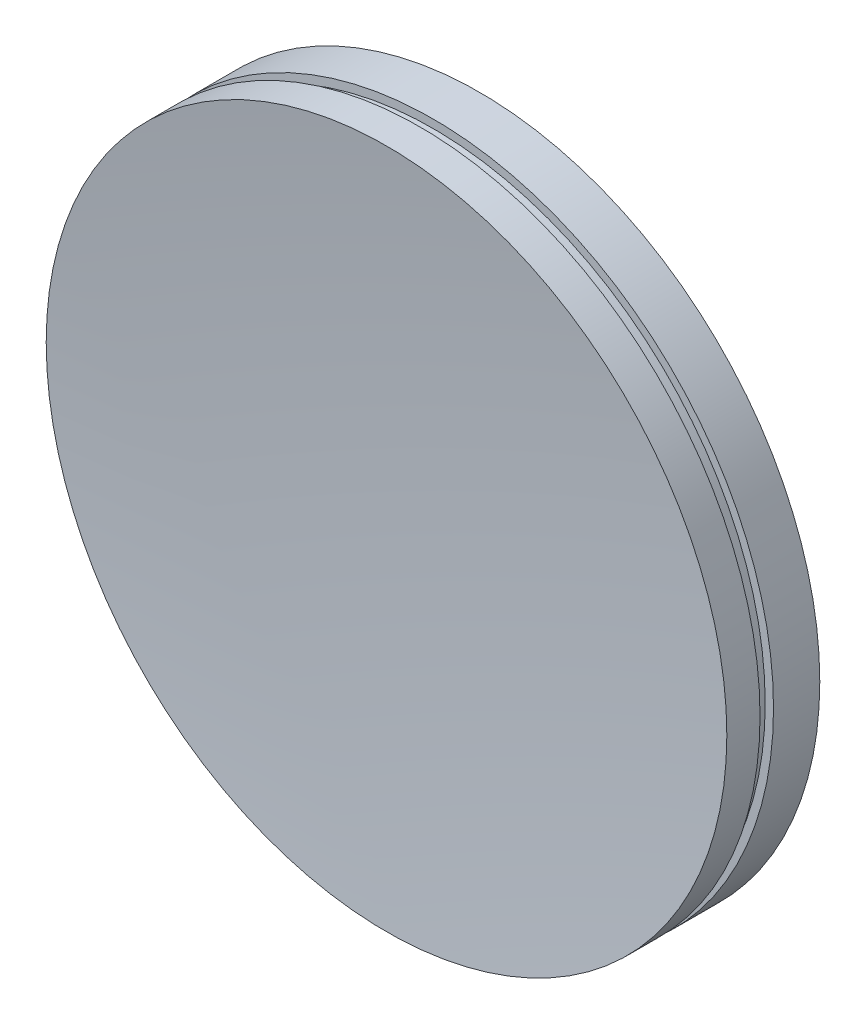
ISO-10303-21;
HEADER;
FILE_DESCRIPTION(('STEP AP214'),'2;1');
FILE_NAME('part.step','',(''),(''),'','','');
FILE_SCHEMA(('AUTOMOTIVE_DESIGN { 1 0 10303 214 1 1 1 1 }'));
ENDSEC;
DATA;
#1=APPLICATION_CONTEXT('core data for automotive mechanical design processes');
#2=APPLICATION_PROTOCOL_DEFINITION('international standard','automotive_design',2000,#1);
#3=PRODUCT_CONTEXT('',#1,'mechanical');
#4=PRODUCT('Part','Part','',(#3));
#5=PRODUCT_RELATED_PRODUCT_CATEGORY('part','',(#4));
#6=PRODUCT_DEFINITION_FORMATION('','',#4);
#7=PRODUCT_DEFINITION_CONTEXT('part definition',#1,'design');
#8=PRODUCT_DEFINITION('design','',#6,#7);
#9=PRODUCT_DEFINITION_SHAPE('','',#8);
#10=(LENGTH_UNIT() NAMED_UNIT(*) SI_UNIT(.MILLI.,.METRE.));
#11=(NAMED_UNIT(*) PLANE_ANGLE_UNIT() SI_UNIT($,.RADIAN.));
#12=(NAMED_UNIT(*) SI_UNIT($,.STERADIAN.) SOLID_ANGLE_UNIT());
#13=UNCERTAINTY_MEASURE_WITH_UNIT(LENGTH_MEASURE(1.E-05),#10,'distance_accuracy_value','');
#14=(GEOMETRIC_REPRESENTATION_CONTEXT(3) GLOBAL_UNCERTAINTY_ASSIGNED_CONTEXT((#13)) GLOBAL_UNIT_ASSIGNED_CONTEXT((#10,
#11,#12)) REPRESENTATION_CONTEXT('',''));
#15=CARTESIAN_POINT('',(0.,0.,0.));
#16=DIRECTION('',(0.,0.,1.));
#17=DIRECTION('',(1.,0.,0.));
#18=AXIS2_PLACEMENT_3D('',#15,#16,#17);
#19=CARTESIAN_POINT('',(0.,0.,56.));
#20=DIRECTION('',(0.,0.,-1.));
#21=DIRECTION('',(-1.,0.,0.));
#22=AXIS2_PLACEMENT_3D('',#19,#20,#21);
#23=CYLINDRICAL_SURFACE('',#22,205.);
#24=CARTESIAN_POINT('',(0.,0.,27.8800000000001));
#25=DIRECTION('',(0.,0.,1.));
#26=DIRECTION('',(1.,0.,0.));
#27=AXIS2_PLACEMENT_3D('',#24,#25,#26);
#28=CIRCLE('',#27,205.);
#29=CARTESIAN_POINT('',(205.,0.,27.8800000000001));
#30=VERTEX_POINT('',#29);
#31=EDGE_CURVE('E51',#30,#30,#28,.T.);
#32=ORIENTED_EDGE('',*,*,#31,.F.);
#33=EDGE_LOOP('',(#32));
#34=FACE_BOUND('',#33,.T.);
#35=CARTESIAN_POINT('',(0.,0.,0.));
#36=DIRECTION('',(0.,0.,1.));
#37=DIRECTION('',(1.,0.,0.));
#38=AXIS2_PLACEMENT_3D('',#35,#36,#37);
#39=CIRCLE('',#38,205.);
#40=CARTESIAN_POINT('',(205.,0.,0.));
#41=VERTEX_POINT('',#40);
#42=EDGE_CURVE('E10',#41,#41,#39,.T.);
#43=ORIENTED_EDGE('',*,*,#42,.T.);
#44=EDGE_LOOP('',(#43));
#45=FACE_BOUND('',#44,.T.);
#46=ADVANCED_FACE('F37',(#34,#45),#23,.T.);
#47=CARTESIAN_POINT('',(0.,0.,0.));
#48=DIRECTION('',(0.,0.,1.));
#49=DIRECTION('',(1.,0.,0.));
#50=AXIS2_PLACEMENT_3D('',#47,#48,#49);
#51=PLANE('',#50);
#52=ORIENTED_EDGE('',*,*,#42,.F.);
#53=EDGE_LOOP('',(#52));
#54=FACE_BOUND('',#53,.T.);
#55=ADVANCED_FACE('F87',(#54),#51,.F.);
#56=CARTESIAN_POINT('',(205.,0.,27.88));
#57=DIRECTION('',(0.,0.,-1.));
#58=DIRECTION('',(-1.,0.,0.));
#59=AXIS2_PLACEMENT_3D('',#56,#57,#58);
#60=PLANE('',#59);
#61=CARTESIAN_POINT('',(0.,0.,27.8800000000001));
#62=DIRECTION('',(0.,0.,1.));
#63=DIRECTION('',(1.,0.,0.));
#64=AXIS2_PLACEMENT_3D('',#61,#62,#63);
#65=CIRCLE('',#64,200.);
#66=CARTESIAN_POINT('',(200.,0.,27.8800000000001));
#67=VERTEX_POINT('',#66);
#68=EDGE_CURVE('E57',#67,#67,#65,.T.);
#69=ORIENTED_EDGE('',*,*,#68,.F.);
#70=EDGE_LOOP('',(#69));
#71=FACE_BOUND('',#70,.T.);
#72=ORIENTED_EDGE('',*,*,#31,.T.);
#73=EDGE_LOOP('',(#72));
#74=FACE_BOUND('',#73,.T.);
#75=ADVANCED_FACE('F81',(#71,#74),#60,.F.);
#76=CARTESIAN_POINT('',(2.4980018054066E-13,0.,2095.72424606857));
#77=DIRECTION('',(0.,0.,1.));
#78=DIRECTION('',(1.,0.,0.));
#79=AXIS2_PLACEMENT_3D('',#76,#77,#78);
#80=CYLINDRICAL_SURFACE('',#79,200.);
#81=CARTESIAN_POINT('',(0.,0.,36.));
#82=DIRECTION('',(0.,0.,1.));
#83=DIRECTION('',(1.,0.,0.));
#84=AXIS2_PLACEMENT_3D('',#81,#82,#83);
#85=CIRCLE('',#84,200.);
#86=CARTESIAN_POINT('',(200.,0.,36.));
#87=VERTEX_POINT('',#86);
#88=EDGE_CURVE('E62',#87,#87,#85,.T.);
#89=ORIENTED_EDGE('',*,*,#88,.F.);
#90=EDGE_LOOP('',(#89));
#91=FACE_BOUND('',#90,.T.);
#92=ORIENTED_EDGE('',*,*,#68,.T.);
#93=EDGE_LOOP('',(#92));
#94=FACE_BOUND('',#93,.T.);
#95=ADVANCED_FACE('F75',(#91,#94),#80,.T.);
#96=CARTESIAN_POINT('',(205.,0.,36.));
#97=DIRECTION('',(0.,0.,1.));
#98=DIRECTION('',(1.,0.,0.));
#99=AXIS2_PLACEMENT_3D('',#96,#97,#98);
#100=PLANE('',#99);
#101=CARTESIAN_POINT('',(0.,0.,36.));
#102=DIRECTION('',(0.,0.,1.));
#103=DIRECTION('',(1.,0.,0.));
#104=AXIS2_PLACEMENT_3D('',#101,#102,#103);
#105=CIRCLE('',#104,205.);
#106=CARTESIAN_POINT('',(205.,0.,36.));
#107=VERTEX_POINT('',#106);
#108=EDGE_CURVE('E65',#107,#107,#105,.T.);
#109=ORIENTED_EDGE('',*,*,#108,.F.);
#110=EDGE_LOOP('',(#109));
#111=FACE_BOUND('',#110,.T.);
#112=ORIENTED_EDGE('',*,*,#88,.T.);
#113=EDGE_LOOP('',(#112));
#114=FACE_BOUND('',#113,.T.);
#115=ADVANCED_FACE('F71',(#111,#114),#100,.F.);
#116=CARTESIAN_POINT('',(2.4980018054066E-13,0.,2095.72424606857));
#117=DIRECTION('',(0.,0.,-1.));
#118=DIRECTION('',(1.,0.,0.));
#119=AXIS2_PLACEMENT_3D('',#116,#117,#118);
#120=SPHERICAL_SURFACE('',#119,2050.);
#121=CARTESIAN_POINT('',(2.4980018054066E-13,0.,56.));
#122=DIRECTION('',(0.,0.,1.));
#123=DIRECTION('',(1.,0.,0.));
#124=AXIS2_PLACEMENT_3D('',#121,#122,#123);
#125=CIRCLE('',#124,205.000000000004);
#126=CARTESIAN_POINT('',(205.000000000004,0.,56.));
#127=VERTEX_POINT('',#126);
#128=EDGE_CURVE('E45',#127,#127,#125,.F.);
#129=ORIENTED_EDGE('',*,*,#128,.F.);
#130=EDGE_LOOP('',(#129));
#131=FACE_BOUND('',#130,.T.);
#132=ADVANCED_FACE('F74',(#131),#120,.F.);
#133=ORIENTED_EDGE('',*,*,#108,.T.);
#134=EDGE_LOOP('',(#133));
#135=FACE_BOUND('',#134,.T.);
#136=ORIENTED_EDGE('',*,*,#128,.T.);
#137=EDGE_LOOP('',(#136));
#138=FACE_BOUND('',#137,.T.);
#139=ADVANCED_FACE('F39',(#135,#138),#23,.T.);
#140=CLOSED_SHELL('',(#46,#55,#75,#95,#115,#132,#139));
#141=MANIFOLD_SOLID_BREP('B2',#140);
#142=ADVANCED_BREP_SHAPE_REPRESENTATION('',(#18,#141),#14);
#143=SHAPE_DEFINITION_REPRESENTATION(#9,#142);
ENDSEC;
END-ISO-10303-21;
